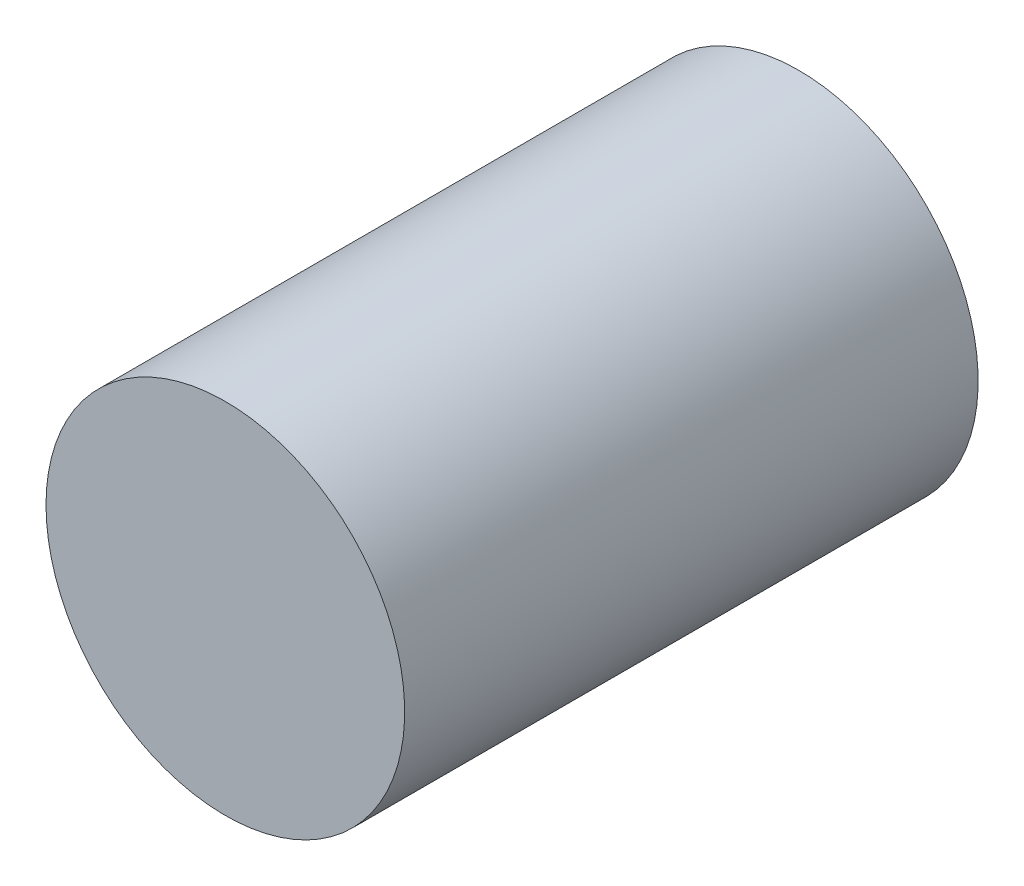
ISO-10303-21;
HEADER;
FILE_DESCRIPTION(('STEP AP214'),'2;1');
FILE_NAME('part.step','',(''),(''),'','','');
FILE_SCHEMA(('AUTOMOTIVE_DESIGN { 1 0 10303 214 1 1 1 1 }'));
ENDSEC;
DATA;
#1=APPLICATION_CONTEXT('core data for automotive mechanical design processes');
#2=APPLICATION_PROTOCOL_DEFINITION('international standard','automotive_design',2000,#1);
#3=PRODUCT_CONTEXT('',#1,'mechanical');
#4=PRODUCT('Part','Part','',(#3));
#5=PRODUCT_RELATED_PRODUCT_CATEGORY('part','',(#4));
#6=PRODUCT_DEFINITION_FORMATION('','',#4);
#7=PRODUCT_DEFINITION_CONTEXT('part definition',#1,'design');
#8=PRODUCT_DEFINITION('design','',#6,#7);
#9=PRODUCT_DEFINITION_SHAPE('','',#8);
#10=(LENGTH_UNIT() NAMED_UNIT(*) SI_UNIT(.MILLI.,.METRE.));
#11=(NAMED_UNIT(*) PLANE_ANGLE_UNIT() SI_UNIT($,.RADIAN.));
#12=(NAMED_UNIT(*) SI_UNIT($,.STERADIAN.) SOLID_ANGLE_UNIT());
#13=UNCERTAINTY_MEASURE_WITH_UNIT(LENGTH_MEASURE(1.E-05),#10,'distance_accuracy_value','');
#14=(GEOMETRIC_REPRESENTATION_CONTEXT(3) GLOBAL_UNCERTAINTY_ASSIGNED_CONTEXT((#13)) GLOBAL_UNIT_ASSIGNED_CONTEXT((#10,
#11,#12)) REPRESENTATION_CONTEXT('',''));
#15=CARTESIAN_POINT('',(0.,0.,0.));
#16=DIRECTION('',(0.,0.,1.));
#17=DIRECTION('',(1.,0.,0.));
#18=AXIS2_PLACEMENT_3D('',#15,#16,#17);
#19=CARTESIAN_POINT('',(4.3,0.,0.));
#20=DIRECTION('',(0.,0.,-1.));
#21=DIRECTION('',(-1.,0.,0.));
#22=AXIS2_PLACEMENT_3D('',#19,#20,#21);
#23=PLANE('',#22);
#24=CARTESIAN_POINT('',(0.,0.,0.));
#25=DIRECTION('',(0.,0.,-1.));
#26=DIRECTION('',(-1.,0.,0.));
#27=AXIS2_PLACEMENT_3D('',#24,#25,#26);
#28=CIRCLE('',#27,4.3);
#29=CARTESIAN_POINT('',(-4.3,0.,0.));
#30=VERTEX_POINT('',#29);
#31=EDGE_CURVE('E18',#30,#30,#28,.F.);
#32=ORIENTED_EDGE('',*,*,#31,.F.);
#33=EDGE_LOOP('',(#32));
#34=FACE_BOUND('',#33,.T.);
#35=ADVANCED_FACE('F15',(#34),#23,.T.);
#36=CARTESIAN_POINT('',(4.3,0.,13.75));
#37=DIRECTION('',(0.,0.,-1.));
#38=DIRECTION('',(-1.,0.,0.));
#39=AXIS2_PLACEMENT_3D('',#36,#37,#38);
#40=PLANE('',#39);
#41=CARTESIAN_POINT('',(0.,0.,13.75));
#42=DIRECTION('',(0.,0.,-1.));
#43=DIRECTION('',(-1.,0.,0.));
#44=AXIS2_PLACEMENT_3D('',#41,#42,#43);
#45=CIRCLE('',#44,4.3);
#46=CARTESIAN_POINT('',(-4.3,0.,13.75));
#47=VERTEX_POINT('',#46);
#48=EDGE_CURVE('E10',#47,#47,#45,.T.);
#49=ORIENTED_EDGE('',*,*,#48,.F.);
#50=EDGE_LOOP('',(#49));
#51=FACE_BOUND('',#50,.T.);
#52=ADVANCED_FACE('F30',(#51),#40,.F.);
#53=CARTESIAN_POINT('',(0.,0.,0.));
#54=DIRECTION('',(0.,0.,-1.));
#55=DIRECTION('',(-1.,0.,0.));
#56=AXIS2_PLACEMENT_3D('',#53,#54,#55);
#57=CYLINDRICAL_SURFACE('',#56,4.3);
#58=ORIENTED_EDGE('',*,*,#31,.T.);
#59=EDGE_LOOP('',(#58));
#60=FACE_BOUND('',#59,.T.);
#61=ORIENTED_EDGE('',*,*,#48,.T.);
#62=EDGE_LOOP('',(#61));
#63=FACE_BOUND('',#62,.T.);
#64=ADVANCED_FACE('F27',(#60,#63),#57,.T.);
#65=CLOSED_SHELL('',(#35,#52,#64));
#66=MANIFOLD_SOLID_BREP('B1',#65);
#67=ADVANCED_BREP_SHAPE_REPRESENTATION('',(#18,#66),#14);
#68=SHAPE_DEFINITION_REPRESENTATION(#9,#67);
ENDSEC;
END-ISO-10303-21;
